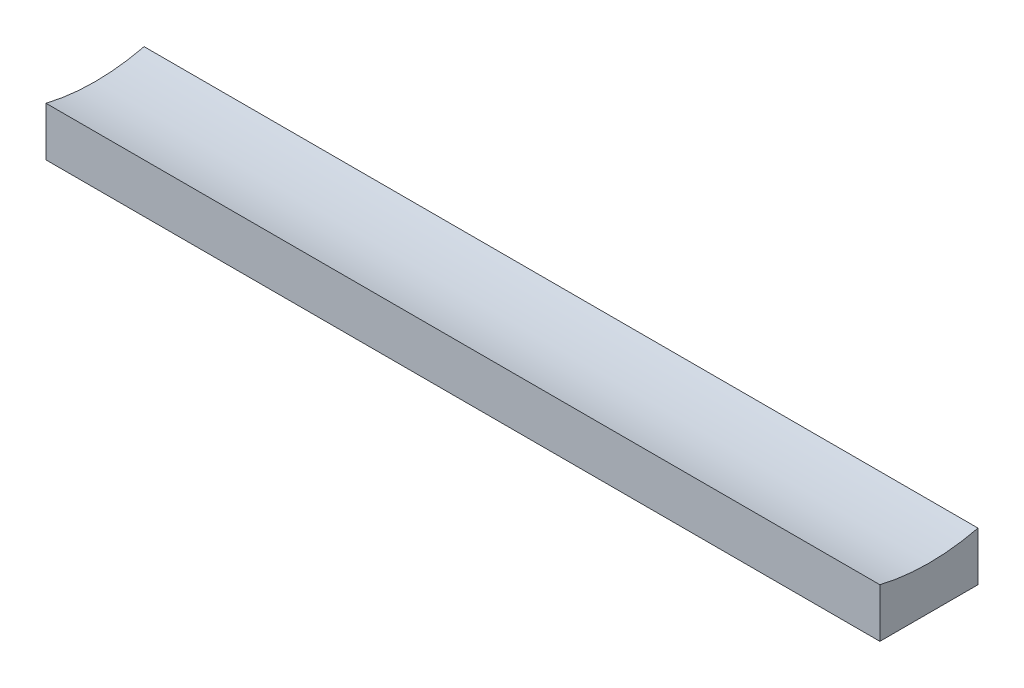
ISO-10303-21;
HEADER;
FILE_DESCRIPTION(('STEP AP214'),'2;1');
FILE_NAME('part.step','',(''),(''),'','','');
FILE_SCHEMA(('AUTOMOTIVE_DESIGN { 1 0 10303 214 1 1 1 1 }'));
ENDSEC;
DATA;
#1=APPLICATION_CONTEXT('core data for automotive mechanical design processes');
#2=APPLICATION_PROTOCOL_DEFINITION('international standard','automotive_design',2000,#1);
#3=PRODUCT_CONTEXT('',#1,'mechanical');
#4=PRODUCT('Part','Part','',(#3));
#5=PRODUCT_RELATED_PRODUCT_CATEGORY('part','',(#4));
#6=PRODUCT_DEFINITION_FORMATION('','',#4);
#7=PRODUCT_DEFINITION_CONTEXT('part definition',#1,'design');
#8=PRODUCT_DEFINITION('design','',#6,#7);
#9=PRODUCT_DEFINITION_SHAPE('','',#8);
#10=(LENGTH_UNIT() NAMED_UNIT(*) SI_UNIT(.MILLI.,.METRE.));
#11=(NAMED_UNIT(*) PLANE_ANGLE_UNIT() SI_UNIT($,.RADIAN.));
#12=(NAMED_UNIT(*) SI_UNIT($,.STERADIAN.) SOLID_ANGLE_UNIT());
#13=UNCERTAINTY_MEASURE_WITH_UNIT(LENGTH_MEASURE(1.E-05),#10,'distance_accuracy_value','');
#14=(GEOMETRIC_REPRESENTATION_CONTEXT(3) GLOBAL_UNCERTAINTY_ASSIGNED_CONTEXT((#13)) GLOBAL_UNIT_ASSIGNED_CONTEXT((#10,
#11,#12)) REPRESENTATION_CONTEXT('',''));
#15=CARTESIAN_POINT('',(0.,0.,0.));
#16=DIRECTION('',(0.,0.,1.));
#17=DIRECTION('',(1.,0.,0.));
#18=AXIS2_PLACEMENT_3D('',#15,#16,#17);
#19=CARTESIAN_POINT('',(85.,10.,10.));
#20=DIRECTION('',(-1.,0.,0.));
#21=DIRECTION('',(0.,0.,1.));
#22=AXIS2_PLACEMENT_3D('',#19,#20,#21);
#23=PLANE('',#22);
#24=DIRECTION('',(0.,-1.,0.));
#25=VECTOR('',#24,1.);
#26=CARTESIAN_POINT('',(85.,10.,-10.));
#27=LINE('',#26,#25);
#28=CARTESIAN_POINT('',(85.,10.,-10.));
#29=VERTEX_POINT('',#28);
#30=CARTESIAN_POINT('',(85.,0.,-10.));
#31=VERTEX_POINT('',#30);
#32=EDGE_CURVE('E11',#29,#31,#27,.T.);
#33=ORIENTED_EDGE('',*,*,#32,.F.);
#34=CARTESIAN_POINT('',(85.,51.3067791046458,0.));
#35=DIRECTION('',(1.,0.,0.));
#36=DIRECTION('',(0.,0.,-1.));
#37=AXIS2_PLACEMENT_3D('',#34,#35,#36);
#38=CIRCLE('',#37,42.5);
#39=CARTESIAN_POINT('',(85.,10.,10.));
#40=VERTEX_POINT('',#39);
#41=EDGE_CURVE('E152',#40,#29,#38,.T.);
#42=ORIENTED_EDGE('',*,*,#41,.F.);
#43=DIRECTION('',(0.,-1.,0.));
#44=VECTOR('',#43,1.);
#45=CARTESIAN_POINT('',(85.,10.,10.));
#46=LINE('',#45,#44);
#47=CARTESIAN_POINT('',(85.,0.,10.));
#48=VERTEX_POINT('',#47);
#49=EDGE_CURVE('E82',#40,#48,#46,.T.);
#50=ORIENTED_EDGE('',*,*,#49,.T.);
#51=DIRECTION('',(0.,0.,-1.));
#52=VECTOR('',#51,1.);
#53=CARTESIAN_POINT('',(85.,0.,10.));
#54=LINE('',#53,#52);
#55=EDGE_CURVE('E87',#48,#31,#54,.T.);
#56=ORIENTED_EDGE('',*,*,#55,.T.);
#57=EDGE_LOOP('',(#33,#42,#50,#56));
#58=FACE_BOUND('',#57,.T.);
#59=ADVANCED_FACE('F34',(#58),#23,.F.);
#60=CARTESIAN_POINT('',(-85.,10.,-10.));
#61=DIRECTION('',(0.,0.,1.));
#62=DIRECTION('',(1.,0.,0.));
#63=AXIS2_PLACEMENT_3D('',#60,#61,#62);
#64=PLANE('',#63);
#65=DIRECTION('',(-1.,0.,0.));
#66=VECTOR('',#65,1.);
#67=CARTESIAN_POINT('',(-85.,0.,-10.));
#68=LINE('',#67,#66);
#69=CARTESIAN_POINT('',(-85.,0.,-10.));
#70=VERTEX_POINT('',#69);
#71=EDGE_CURVE('E75',#31,#70,#68,.T.);
#72=ORIENTED_EDGE('',*,*,#71,.T.);
#73=DIRECTION('',(0.,-1.,0.));
#74=VECTOR('',#73,1.);
#75=CARTESIAN_POINT('',(-85.,10.,-10.));
#76=LINE('',#75,#74);
#77=CARTESIAN_POINT('',(-85.,10.,-10.));
#78=VERTEX_POINT('',#77);
#79=EDGE_CURVE('E42',#78,#70,#76,.T.);
#80=ORIENTED_EDGE('',*,*,#79,.F.);
#81=DIRECTION('',(-1.,0.,0.));
#82=VECTOR('',#81,1.);
#83=CARTESIAN_POINT('',(-85.,10.,-10.));
#84=LINE('',#83,#82);
#85=EDGE_CURVE('E88',#29,#78,#84,.T.);
#86=ORIENTED_EDGE('',*,*,#85,.F.);
#87=ORIENTED_EDGE('',*,*,#32,.T.);
#88=EDGE_LOOP('',(#72,#80,#86,#87));
#89=FACE_BOUND('',#88,.T.);
#90=ADVANCED_FACE('F101',(#89),#64,.F.);
#91=CARTESIAN_POINT('',(-85.,10.,10.));
#92=DIRECTION('',(1.,0.,0.));
#93=DIRECTION('',(0.,0.,-1.));
#94=AXIS2_PLACEMENT_3D('',#91,#92,#93);
#95=PLANE('',#94);
#96=DIRECTION('',(0.,-1.,0.));
#97=VECTOR('',#96,1.);
#98=CARTESIAN_POINT('',(-85.,10.,10.));
#99=LINE('',#98,#97);
#100=CARTESIAN_POINT('',(-85.,10.,10.));
#101=VERTEX_POINT('',#100);
#102=CARTESIAN_POINT('',(-85.,0.,10.));
#103=VERTEX_POINT('',#102);
#104=EDGE_CURVE('E69',#101,#103,#99,.T.);
#105=ORIENTED_EDGE('',*,*,#104,.F.);
#106=CARTESIAN_POINT('',(-85.,51.3067791046458,0.));
#107=DIRECTION('',(1.,0.,0.));
#108=DIRECTION('',(0.,0.,-1.));
#109=AXIS2_PLACEMENT_3D('',#106,#107,#108);
#110=CIRCLE('',#109,42.5);
#111=EDGE_CURVE('E49',#78,#101,#110,.F.);
#112=ORIENTED_EDGE('',*,*,#111,.F.);
#113=ORIENTED_EDGE('',*,*,#79,.T.);
#114=DIRECTION('',(0.,0.,1.));
#115=VECTOR('',#114,1.);
#116=CARTESIAN_POINT('',(-85.,0.,10.));
#117=LINE('',#116,#115);
#118=EDGE_CURVE('E66',#70,#103,#117,.T.);
#119=ORIENTED_EDGE('',*,*,#118,.T.);
#120=EDGE_LOOP('',(#105,#112,#113,#119));
#121=FACE_BOUND('',#120,.T.);
#122=ADVANCED_FACE('F68',(#121),#95,.F.);
#123=CARTESIAN_POINT('',(-85.,10.,10.));
#124=DIRECTION('',(0.,0.,-1.));
#125=DIRECTION('',(-1.,0.,0.));
#126=AXIS2_PLACEMENT_3D('',#123,#124,#125);
#127=PLANE('',#126);
#128=DIRECTION('',(1.,0.,0.));
#129=VECTOR('',#128,1.);
#130=CARTESIAN_POINT('',(-85.,0.,10.));
#131=LINE('',#130,#129);
#132=EDGE_CURVE('E74',#103,#48,#131,.T.);
#133=ORIENTED_EDGE('',*,*,#132,.T.);
#134=ORIENTED_EDGE('',*,*,#49,.F.);
#135=DIRECTION('',(1.,0.,0.));
#136=VECTOR('',#135,1.);
#137=CARTESIAN_POINT('',(-85.,10.,10.));
#138=LINE('',#137,#136);
#139=EDGE_CURVE('E81',#101,#40,#138,.T.);
#140=ORIENTED_EDGE('',*,*,#139,.F.);
#141=ORIENTED_EDGE('',*,*,#104,.T.);
#142=EDGE_LOOP('',(#133,#134,#140,#141));
#143=FACE_BOUND('',#142,.T.);
#144=ADVANCED_FACE('F78',(#143),#127,.F.);
#145=CARTESIAN_POINT('',(0.,0.,0.));
#146=DIRECTION('',(0.,-1.,0.));
#147=DIRECTION('',(0.,0.,-1.));
#148=AXIS2_PLACEMENT_3D('',#145,#146,#147);
#149=PLANE('',#148);
#150=ORIENTED_EDGE('',*,*,#55,.F.);
#151=ORIENTED_EDGE('',*,*,#132,.F.);
#152=ORIENTED_EDGE('',*,*,#118,.F.);
#153=ORIENTED_EDGE('',*,*,#71,.F.);
#154=EDGE_LOOP('',(#150,#151,#152,#153));
#155=FACE_BOUND('',#154,.T.);
#156=ADVANCED_FACE('F85',(#155),#149,.T.);
#157=CARTESIAN_POINT('',(-205.208152801713,51.3067791046458,0.));
#158=DIRECTION('',(1.,0.,0.));
#159=DIRECTION('',(0.,0.,-1.));
#160=AXIS2_PLACEMENT_3D('',#157,#158,#159);
#161=CYLINDRICAL_SURFACE('',#160,42.5);
#162=ORIENTED_EDGE('',*,*,#111,.T.);
#163=ORIENTED_EDGE('',*,*,#139,.T.);
#164=ORIENTED_EDGE('',*,*,#41,.T.);
#165=ORIENTED_EDGE('',*,*,#85,.T.);
#166=EDGE_LOOP('',(#162,#163,#164,#165));
#167=FACE_BOUND('',#166,.T.);
#168=ADVANCED_FACE('F118',(#167),#161,.F.);
#169=CLOSED_SHELL('',(#59,#90,#122,#144,#156,#168));
#170=MANIFOLD_SOLID_BREP('B2',#169);
#171=ADVANCED_BREP_SHAPE_REPRESENTATION('',(#18,#170),#14);
#172=SHAPE_DEFINITION_REPRESENTATION(#9,#171);
ENDSEC;
END-ISO-10303-21;
